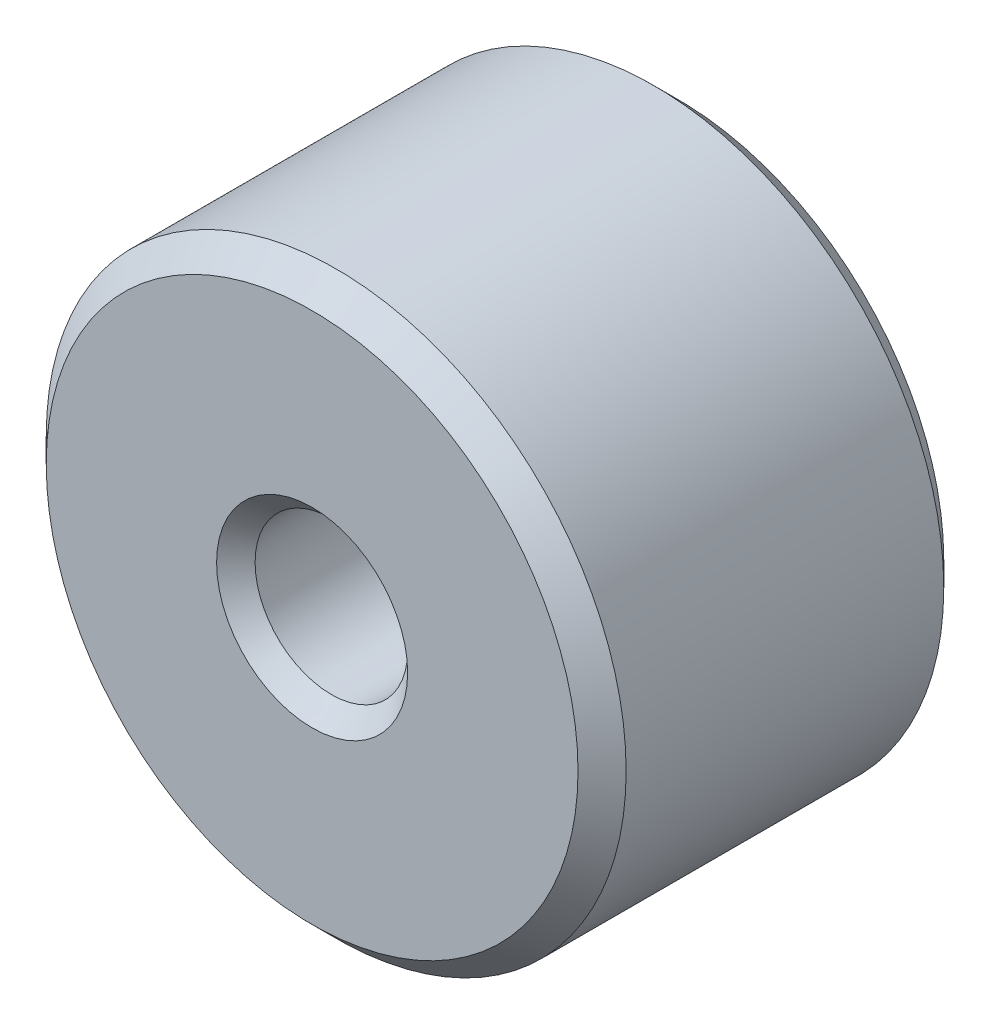
ISO-10303-21;
HEADER;
FILE_DESCRIPTION(('STEP AP214'),'2;1');
FILE_NAME('part.step','',(''),(''),'','','');
FILE_SCHEMA(('AUTOMOTIVE_DESIGN { 1 0 10303 214 1 1 1 1 }'));
ENDSEC;
DATA;
#1=APPLICATION_CONTEXT('core data for automotive mechanical design processes');
#2=APPLICATION_PROTOCOL_DEFINITION('international standard','automotive_design',2000,#1);
#3=PRODUCT_CONTEXT('',#1,'mechanical');
#4=PRODUCT('Part','Part','',(#3));
#5=PRODUCT_RELATED_PRODUCT_CATEGORY('part','',(#4));
#6=PRODUCT_DEFINITION_FORMATION('','',#4);
#7=PRODUCT_DEFINITION_CONTEXT('part definition',#1,'design');
#8=PRODUCT_DEFINITION('design','',#6,#7);
#9=PRODUCT_DEFINITION_SHAPE('','',#8);
#10=(LENGTH_UNIT() NAMED_UNIT(*) SI_UNIT(.MILLI.,.METRE.));
#11=(NAMED_UNIT(*) PLANE_ANGLE_UNIT() SI_UNIT($,.RADIAN.));
#12=(NAMED_UNIT(*) SI_UNIT($,.STERADIAN.) SOLID_ANGLE_UNIT());
#13=UNCERTAINTY_MEASURE_WITH_UNIT(LENGTH_MEASURE(1.E-05),#10,'distance_accuracy_value','');
#14=(GEOMETRIC_REPRESENTATION_CONTEXT(3) GLOBAL_UNCERTAINTY_ASSIGNED_CONTEXT((#13)) GLOBAL_UNIT_ASSIGNED_CONTEXT((#10,
#11,#12)) REPRESENTATION_CONTEXT('',''));
#15=CARTESIAN_POINT('',(0.,0.,0.));
#16=DIRECTION('',(0.,0.,1.));
#17=DIRECTION('',(1.,0.,0.));
#18=AXIS2_PLACEMENT_3D('',#15,#16,#17);
#19=CARTESIAN_POINT('',(0.,0.,7.6));
#20=DIRECTION('',(0.,0.,1.));
#21=DIRECTION('',(1.,0.,0.));
#22=AXIS2_PLACEMENT_3D('',#19,#20,#21);
#23=PLANE('',#22);
#24=CARTESIAN_POINT('',(0.,0.,7.6));
#25=DIRECTION('',(0.,0.,1.));
#26=DIRECTION('',(1.,0.,0.));
#27=AXIS2_PLACEMENT_3D('',#24,#25,#26);
#28=CIRCLE('',#27,1.98500000000001);
#29=CARTESIAN_POINT('',(1.98500000000001,0.,7.6));
#30=VERTEX_POINT('',#29);
#31=EDGE_CURVE('E53',#30,#30,#28,.F.);
#32=ORIENTED_EDGE('',*,*,#31,.T.);
#33=EDGE_LOOP('',(#32));
#34=FACE_BOUND('',#33,.T.);
#35=CARTESIAN_POINT('',(0.,0.,7.6));
#36=DIRECTION('',(0.,0.,1.));
#37=DIRECTION('',(1.,0.,0.));
#38=AXIS2_PLACEMENT_3D('',#35,#36,#37);
#39=CIRCLE('',#38,5.52500000000001);
#40=CARTESIAN_POINT('',(5.52500000000001,0.,7.6));
#41=VERTEX_POINT('',#40);
#42=EDGE_CURVE('E76',#41,#41,#39,.T.);
#43=ORIENTED_EDGE('',*,*,#42,.T.);
#44=EDGE_LOOP('',(#43));
#45=FACE_BOUND('',#44,.T.);
#46=ADVANCED_FACE('F39',(#34,#45),#23,.T.);
#47=CARTESIAN_POINT('',(0.,0.,0.));
#48=DIRECTION('',(0.,0.,1.));
#49=DIRECTION('',(1.,0.,0.));
#50=AXIS2_PLACEMENT_3D('',#47,#48,#49);
#51=PLANE('',#50);
#52=CARTESIAN_POINT('',(0.,0.,0.));
#53=DIRECTION('',(0.,0.,1.));
#54=DIRECTION('',(1.,0.,0.));
#55=AXIS2_PLACEMENT_3D('',#52,#53,#54);
#56=CIRCLE('',#55,2.58499999999999);
#57=CARTESIAN_POINT('',(2.58499999999999,0.,0.));
#58=VERTEX_POINT('',#57);
#59=EDGE_CURVE('E48',#58,#58,#56,.T.);
#60=ORIENTED_EDGE('',*,*,#59,.T.);
#61=EDGE_LOOP('',(#60));
#62=FACE_BOUND('',#61,.T.);
#63=CARTESIAN_POINT('',(0.,0.,0.));
#64=DIRECTION('',(0.,0.,1.));
#65=DIRECTION('',(1.,0.,0.));
#66=AXIS2_PLACEMENT_3D('',#63,#64,#65);
#67=CIRCLE('',#66,5.52499999999999);
#68=CARTESIAN_POINT('',(5.52499999999999,0.,0.));
#69=VERTEX_POINT('',#68);
#70=EDGE_CURVE('E64',#69,#69,#67,.F.);
#71=ORIENTED_EDGE('',*,*,#70,.T.);
#72=EDGE_LOOP('',(#71));
#73=FACE_BOUND('',#72,.T.);
#74=ADVANCED_FACE('F100',(#62,#73),#51,.F.);
#75=CARTESIAN_POINT('',(0.,0.,7.6));
#76=DIRECTION('',(0.,0.,-1.));
#77=DIRECTION('',(-1.,0.,0.));
#78=AXIS2_PLACEMENT_3D('',#75,#76,#77);
#79=CYLINDRICAL_SURFACE('',#78,6.025);
#80=CARTESIAN_POINT('',(0.,0.,7.10000000000001));
#81=DIRECTION('',(0.,0.,1.));
#82=DIRECTION('',(1.,0.,0.));
#83=AXIS2_PLACEMENT_3D('',#80,#81,#82);
#84=CIRCLE('',#83,6.025);
#85=CARTESIAN_POINT('',(-6.025,0.,7.10000000000001));
#86=VERTEX_POINT('',#85);
#87=EDGE_CURVE('E68',#86,#86,#84,.F.);
#88=CARTESIAN_POINT('',(0.,0.,0.500000000000005));
#89=DIRECTION('',(0.,0.,1.));
#90=DIRECTION('',(1.,0.,0.));
#91=AXIS2_PLACEMENT_3D('',#88,#89,#90);
#92=CIRCLE('',#91,6.025);
#93=CARTESIAN_POINT('',(-6.025,0.,0.500000000000004));
#94=VERTEX_POINT('',#93);
#95=EDGE_CURVE('E72',#94,#94,#92,.T.);
#96=CARTESIAN_POINT('',(-6.025,0.,7.10000000000001));
#97=CARTESIAN_POINT('',(-6.025,0.,7.03125000000001));
#98=CARTESIAN_POINT('',(-6.025,0.,6.96250000000001));
#99=CARTESIAN_POINT('',(-6.025,0.,6.82500000000001));
#100=CARTESIAN_POINT('',(-6.025,0.,6.75625000000001));
#101=CARTESIAN_POINT('',(-6.025,0.,6.61875000000001));
#102=CARTESIAN_POINT('',(-6.025,0.,6.55000000000001));
#103=CARTESIAN_POINT('',(-6.025,0.,6.41250000000001));
#104=CARTESIAN_POINT('',(-6.025,0.,6.34375000000001));
#105=CARTESIAN_POINT('',(-6.025,0.,6.20625000000001));
#106=CARTESIAN_POINT('',(-6.025,0.,6.13750000000001));
#107=CARTESIAN_POINT('',(-6.025,0.,6.00000000000001));
#108=CARTESIAN_POINT('',(-6.025,0.,5.93125000000001));
#109=CARTESIAN_POINT('',(-6.025,0.,5.79375000000001));
#110=CARTESIAN_POINT('',(-6.025,0.,5.72500000000001));
#111=CARTESIAN_POINT('',(-6.025,0.,5.58750000000001));
#112=CARTESIAN_POINT('',(-6.025,0.,5.51875000000001));
#113=CARTESIAN_POINT('',(-6.025,0.,5.38125000000001));
#114=CARTESIAN_POINT('',(-6.025,0.,5.31250000000001));
#115=CARTESIAN_POINT('',(-6.025,0.,5.17500000000001));
#116=CARTESIAN_POINT('',(-6.025,0.,5.10625000000001));
#117=CARTESIAN_POINT('',(-6.025,0.,4.96875000000001));
#118=CARTESIAN_POINT('',(-6.025,0.,4.90000000000001));
#119=CARTESIAN_POINT('',(-6.025,0.,4.76250000000001));
#120=CARTESIAN_POINT('',(-6.025,0.,4.69375000000001));
#121=CARTESIAN_POINT('',(-6.025,0.,4.55625000000001));
#122=CARTESIAN_POINT('',(-6.025,0.,4.48750000000001));
#123=CARTESIAN_POINT('',(-6.025,0.,4.35000000000001));
#124=CARTESIAN_POINT('',(-6.025,0.,4.28125000000001));
#125=CARTESIAN_POINT('',(-6.025,0.,4.14375000000001));
#126=CARTESIAN_POINT('',(-6.025,0.,4.07500000000001));
#127=CARTESIAN_POINT('',(-6.025,0.,3.93750000000001));
#128=CARTESIAN_POINT('',(-6.025,0.,3.86875000000001));
#129=CARTESIAN_POINT('',(-6.025,0.,3.73125000000001));
#130=CARTESIAN_POINT('',(-6.025,0.,3.66250000000001));
#131=CARTESIAN_POINT('',(-6.025,0.,3.52500000000001));
#132=CARTESIAN_POINT('',(-6.025,0.,3.45625000000001));
#133=CARTESIAN_POINT('',(-6.025,0.,3.31875000000001));
#134=CARTESIAN_POINT('',(-6.025,0.,3.25000000000001));
#135=CARTESIAN_POINT('',(-6.025,0.,3.11250000000001));
#136=CARTESIAN_POINT('',(-6.025,0.,3.04375000000001));
#137=CARTESIAN_POINT('',(-6.025,0.,2.90625000000001));
#138=CARTESIAN_POINT('',(-6.025,0.,2.83750000000001));
#139=CARTESIAN_POINT('',(-6.025,0.,2.70000000000001));
#140=CARTESIAN_POINT('',(-6.025,0.,2.63125000000001));
#141=CARTESIAN_POINT('',(-6.025,0.,2.49375000000001));
#142=CARTESIAN_POINT('',(-6.025,0.,2.42500000000001));
#143=CARTESIAN_POINT('',(-6.025,0.,2.28750000000001));
#144=CARTESIAN_POINT('',(-6.025,0.,2.21875));
#145=CARTESIAN_POINT('',(-6.025,0.,2.08125000000001));
#146=CARTESIAN_POINT('',(-6.025,0.,2.01250000000001));
#147=CARTESIAN_POINT('',(-6.025,0.,1.87500000000001));
#148=CARTESIAN_POINT('',(-6.025,0.,1.80625));
#149=CARTESIAN_POINT('',(-6.025,0.,1.66875));
#150=CARTESIAN_POINT('',(-6.025,0.,1.6));
#151=CARTESIAN_POINT('',(-6.025,0.,1.4625));
#152=CARTESIAN_POINT('',(-6.025,0.,1.39375));
#153=CARTESIAN_POINT('',(-6.025,0.,1.25625));
#154=CARTESIAN_POINT('',(-6.025,0.,1.1875));
#155=CARTESIAN_POINT('',(-6.025,0.,1.05));
#156=CARTESIAN_POINT('',(-6.025,0.,0.981250000000005));
#157=CARTESIAN_POINT('',(-6.025,0.,0.843750000000004));
#158=CARTESIAN_POINT('',(-6.025,0.,0.775000000000004));
#159=CARTESIAN_POINT('',(-6.025,0.,0.637500000000004));
#160=CARTESIAN_POINT('',(-6.025,0.,0.568750000000004));
#161=CARTESIAN_POINT('',(-6.025,0.,0.500000000000004));
#162=B_SPLINE_CURVE_WITH_KNOTS('',3,(#96,#97,#98,#99,#100,#101,#102,#103,#104,#105,#106,#107,
#108,#109,#110,#111,#112,#113,#114,#115,#116,#117,#118,#119,#120,#121,#122,#123,#124,#125,#126,
#127,#128,#129,#130,#131,#132,#133,#134,#135,#136,#137,#138,#139,#140,#141,#142,#143,#144,#145,
#146,#147,#148,#149,#150,#151,#152,#153,#154,#155,#156,#157,#158,#159,#160,#161),.UNSPECIFIED.,
.F.,.F.,(4,2,2,2,2,2,2,2,2,2,2,2,2,2,2,2,2,2,2,2,2,2,2,2,2,2,2,2,2,2,2,2,4),(0.,0.20625,0.4125,
0.61875,0.825,1.03125,1.2375,1.44375,1.65,1.85625,2.0625,2.26875,2.475,2.68125,2.8875,3.09375,
3.3,3.50625,3.7125,3.91875,4.125,4.33125,4.5375,4.74375,4.95,5.15625,5.3625,5.56875,5.775,
5.98125,6.1875,6.39375,6.6),.UNSPECIFIED.);
#163=EDGE_CURVE('BSEAM95',#86,#94,#162,.T.);
#164=ORIENTED_EDGE('',*,*,#87,.T.);
#165=ORIENTED_EDGE('',*,*,#95,.T.);
#166=ORIENTED_EDGE('',*,*,#163,.T.);
#167=ORIENTED_EDGE('',*,*,#163,.F.);
#168=EDGE_LOOP('',(#164,#166,#165,#167));
#169=FACE_BOUND('',#168,.T.);
#170=ADVANCED_FACE('F95',(#169),#79,.T.);
#171=CARTESIAN_POINT('',(0.,0.,7.6));
#172=DIRECTION('',(0.,0.,-1.));
#173=DIRECTION('',(-1.,0.,0.));
#174=AXIS2_PLACEMENT_3D('',#171,#172,#173);
#175=CYLINDRICAL_SURFACE('',#174,1.585);
#176=CARTESIAN_POINT('',(0.,0.,0.999999999999997));
#177=DIRECTION('',(0.,0.,1.));
#178=DIRECTION('',(1.,0.,0.));
#179=AXIS2_PLACEMENT_3D('',#176,#177,#178);
#180=CIRCLE('',#179,1.585);
#181=CARTESIAN_POINT('',(-1.585,0.,0.999999999999996));
#182=VERTEX_POINT('',#181);
#183=EDGE_CURVE('E10',#182,#182,#180,.F.);
#184=CARTESIAN_POINT('',(0.,0.,7.19999999999999));
#185=DIRECTION('',(0.,0.,1.));
#186=DIRECTION('',(1.,0.,0.));
#187=AXIS2_PLACEMENT_3D('',#184,#185,#186);
#188=CIRCLE('',#187,1.585);
#189=CARTESIAN_POINT('',(-1.585,0.,7.19999999999999));
#190=VERTEX_POINT('',#189);
#191=EDGE_CURVE('E58',#190,#190,#188,.T.);
#192=CARTESIAN_POINT('',(-1.585,0.,0.999999999999996));
#193=CARTESIAN_POINT('',(-1.585,0.,1.06458333333333));
#194=CARTESIAN_POINT('',(-1.585,0.,1.12916666666666));
#195=CARTESIAN_POINT('',(-1.585,0.,1.25833333333333));
#196=CARTESIAN_POINT('',(-1.585,0.,1.32291666666666));
#197=CARTESIAN_POINT('',(-1.585,0.,1.45208333333333));
#198=CARTESIAN_POINT('',(-1.585,0.,1.51666666666666));
#199=CARTESIAN_POINT('',(-1.585,0.,1.64583333333333));
#200=CARTESIAN_POINT('',(-1.585,0.,1.71041666666666));
#201=CARTESIAN_POINT('',(-1.585,0.,1.83958333333333));
#202=CARTESIAN_POINT('',(-1.585,0.,1.90416666666666));
#203=CARTESIAN_POINT('',(-1.585,0.,2.03333333333333));
#204=CARTESIAN_POINT('',(-1.585,0.,2.09791666666666));
#205=CARTESIAN_POINT('',(-1.585,0.,2.22708333333333));
#206=CARTESIAN_POINT('',(-1.585,0.,2.29166666666666));
#207=CARTESIAN_POINT('',(-1.585,0.,2.42083333333333));
#208=CARTESIAN_POINT('',(-1.585,0.,2.48541666666666));
#209=CARTESIAN_POINT('',(-1.585,0.,2.61458333333333));
#210=CARTESIAN_POINT('',(-1.585,0.,2.67916666666666));
#211=CARTESIAN_POINT('',(-1.585,0.,2.80833333333333));
#212=CARTESIAN_POINT('',(-1.585,0.,2.87291666666666));
#213=CARTESIAN_POINT('',(-1.585,0.,3.00208333333333));
#214=CARTESIAN_POINT('',(-1.585,0.,3.06666666666666));
#215=CARTESIAN_POINT('',(-1.585,0.,3.19583333333333));
#216=CARTESIAN_POINT('',(-1.585,0.,3.26041666666666));
#217=CARTESIAN_POINT('',(-1.585,0.,3.38958333333333));
#218=CARTESIAN_POINT('',(-1.585,0.,3.45416666666666));
#219=CARTESIAN_POINT('',(-1.585,0.,3.58333333333333));
#220=CARTESIAN_POINT('',(-1.585,0.,3.64791666666666));
#221=CARTESIAN_POINT('',(-1.585,0.,3.77708333333333));
#222=CARTESIAN_POINT('',(-1.585,0.,3.84166666666666));
#223=CARTESIAN_POINT('',(-1.585,0.,3.97083333333333));
#224=CARTESIAN_POINT('',(-1.585,0.,4.03541666666666));
#225=CARTESIAN_POINT('',(-1.585,0.,4.16458333333333));
#226=CARTESIAN_POINT('',(-1.585,0.,4.22916666666666));
#227=CARTESIAN_POINT('',(-1.585,0.,4.35833333333333));
#228=CARTESIAN_POINT('',(-1.585,0.,4.42291666666666));
#229=CARTESIAN_POINT('',(-1.585,0.,4.55208333333333));
#230=CARTESIAN_POINT('',(-1.585,0.,4.61666666666666));
#231=CARTESIAN_POINT('',(-1.585,0.,4.74583333333333));
#232=CARTESIAN_POINT('',(-1.585,0.,4.81041666666666));
#233=CARTESIAN_POINT('',(-1.585,0.,4.93958333333333));
#234=CARTESIAN_POINT('',(-1.585,0.,5.00416666666666));
#235=CARTESIAN_POINT('',(-1.585,0.,5.13333333333333));
#236=CARTESIAN_POINT('',(-1.585,0.,5.19791666666666));
#237=CARTESIAN_POINT('',(-1.585,0.,5.32708333333333));
#238=CARTESIAN_POINT('',(-1.585,0.,5.39166666666666));
#239=CARTESIAN_POINT('',(-1.585,0.,5.52083333333333));
#240=CARTESIAN_POINT('',(-1.585,0.,5.58541666666666));
#241=CARTESIAN_POINT('',(-1.585,0.,5.71458333333332));
#242=CARTESIAN_POINT('',(-1.585,0.,5.77916666666666));
#243=CARTESIAN_POINT('',(-1.585,0.,5.90833333333332));
#244=CARTESIAN_POINT('',(-1.585,0.,5.97291666666666));
#245=CARTESIAN_POINT('',(-1.585,0.,6.10208333333332));
#246=CARTESIAN_POINT('',(-1.585,0.,6.16666666666666));
#247=CARTESIAN_POINT('',(-1.585,0.,6.29583333333332));
#248=CARTESIAN_POINT('',(-1.585,0.,6.36041666666666));
#249=CARTESIAN_POINT('',(-1.585,0.,6.48958333333332));
#250=CARTESIAN_POINT('',(-1.585,0.,6.55416666666666));
#251=CARTESIAN_POINT('',(-1.585,0.,6.68333333333332));
#252=CARTESIAN_POINT('',(-1.585,0.,6.74791666666666));
#253=CARTESIAN_POINT('',(-1.585,0.,6.87708333333332));
#254=CARTESIAN_POINT('',(-1.585,0.,6.94166666666666));
#255=CARTESIAN_POINT('',(-1.585,0.,7.07083333333332));
#256=CARTESIAN_POINT('',(-1.585,0.,7.13541666666666));
#257=CARTESIAN_POINT('',(-1.585,0.,7.19999999999999));
#258=B_SPLINE_CURVE_WITH_KNOTS('',3,(#192,#193,#194,#195,#196,#197,#198,#199,#200,#201,#202,
#203,#204,#205,#206,#207,#208,#209,#210,#211,#212,#213,#214,#215,#216,#217,#218,#219,#220,#221,
#222,#223,#224,#225,#226,#227,#228,#229,#230,#231,#232,#233,#234,#235,#236,#237,#238,#239,#240,
#241,#242,#243,#244,#245,#246,#247,#248,#249,#250,#251,#252,#253,#254,#255,#256,#257),
.UNSPECIFIED.,.F.,.F.,(4,2,2,2,2,2,2,2,2,2,2,2,2,2,2,2,2,2,2,2,2,2,2,2,2,2,2,2,2,2,2,2,4),(0.,
0.193749999999999,0.3875,0.581249999999999,0.775,0.968749999999999,1.1625,1.35625,1.55,1.74375,
1.9375,2.13125,2.325,2.51875,2.7125,2.90625,3.1,3.29375,3.4875,3.68125,3.875,4.06875,4.2625,
4.45625,4.65,4.84375,5.0375,5.23125,5.42499999999999,5.61875,5.81249999999999,6.00625,
6.19999999999999),.UNSPECIFIED.);
#259=EDGE_CURVE('BSEAM85',#182,#190,#258,.T.);
#260=ORIENTED_EDGE('',*,*,#183,.T.);
#261=ORIENTED_EDGE('',*,*,#191,.T.);
#262=ORIENTED_EDGE('',*,*,#259,.T.);
#263=ORIENTED_EDGE('',*,*,#259,.F.);
#264=EDGE_LOOP('',(#260,#262,#261,#263));
#265=FACE_BOUND('',#264,.T.);
#266=ADVANCED_FACE('F85',(#265),#175,.F.);
#267=CARTESIAN_POINT('',(0.,0.,7.6));
#268=DIRECTION('',(0.,0.,-1.));
#269=DIRECTION('',(-1.,0.,0.));
#270=AXIS2_PLACEMENT_3D('',#267,#268,#269);
#271=CONICAL_SURFACE('',#270,5.52500000000001,0.785398163397445);
#272=ORIENTED_EDGE('',*,*,#87,.F.);
#273=EDGE_LOOP('',(#272));
#274=FACE_BOUND('',#273,.T.);
#275=ORIENTED_EDGE('',*,*,#42,.F.);
#276=EDGE_LOOP('',(#275));
#277=FACE_BOUND('',#276,.T.);
#278=ADVANCED_FACE('F82',(#274,#277),#271,.T.);
#279=CARTESIAN_POINT('',(0.,0.,0.500000000000005));
#280=DIRECTION('',(0.,0.,1.));
#281=DIRECTION('',(1.,0.,0.));
#282=AXIS2_PLACEMENT_3D('',#279,#280,#281);
#283=CONICAL_SURFACE('',#282,6.025,0.785398163397451);
#284=ORIENTED_EDGE('',*,*,#70,.F.);
#285=EDGE_LOOP('',(#284));
#286=FACE_BOUND('',#285,.T.);
#287=ORIENTED_EDGE('',*,*,#95,.F.);
#288=EDGE_LOOP('',(#287));
#289=FACE_BOUND('',#288,.T.);
#290=ADVANCED_FACE('F84',(#286,#289),#283,.T.);
#291=CARTESIAN_POINT('',(0.,0.,7.19999999999999));
#292=DIRECTION('',(0.,0.,1.));
#293=DIRECTION('',(1.,0.,0.));
#294=AXIS2_PLACEMENT_3D('',#291,#292,#293);
#295=CONICAL_SURFACE('',#294,1.585,0.785398163397448);
#296=ORIENTED_EDGE('',*,*,#31,.F.);
#297=EDGE_LOOP('',(#296));
#298=FACE_BOUND('',#297,.T.);
#299=ORIENTED_EDGE('',*,*,#191,.F.);
#300=EDGE_LOOP('',(#299));
#301=FACE_BOUND('',#300,.T.);
#302=ADVANCED_FACE('F92',(#298,#301),#295,.F.);
#303=CARTESIAN_POINT('',(0.,0.,0.));
#304=DIRECTION('',(0.,0.,-1.));
#305=DIRECTION('',(-1.,0.,0.));
#306=AXIS2_PLACEMENT_3D('',#303,#304,#305);
#307=CONICAL_SURFACE('',#306,2.58499999999999,0.785398163397445);
#308=ORIENTED_EDGE('',*,*,#183,.F.);
#309=EDGE_LOOP('',(#308));
#310=FACE_BOUND('',#309,.T.);
#311=ORIENTED_EDGE('',*,*,#59,.F.);
#312=EDGE_LOOP('',(#311));
#313=FACE_BOUND('',#312,.T.);
#314=ADVANCED_FACE('F42',(#310,#313),#307,.F.);
#315=CLOSED_SHELL('',(#46,#74,#170,#266,#278,#290,#302,#314));
#316=MANIFOLD_SOLID_BREP('B2',#315);
#317=ADVANCED_BREP_SHAPE_REPRESENTATION('',(#18,#316),#14);
#318=SHAPE_DEFINITION_REPRESENTATION(#9,#317);
ENDSEC;
END-ISO-10303-21;
